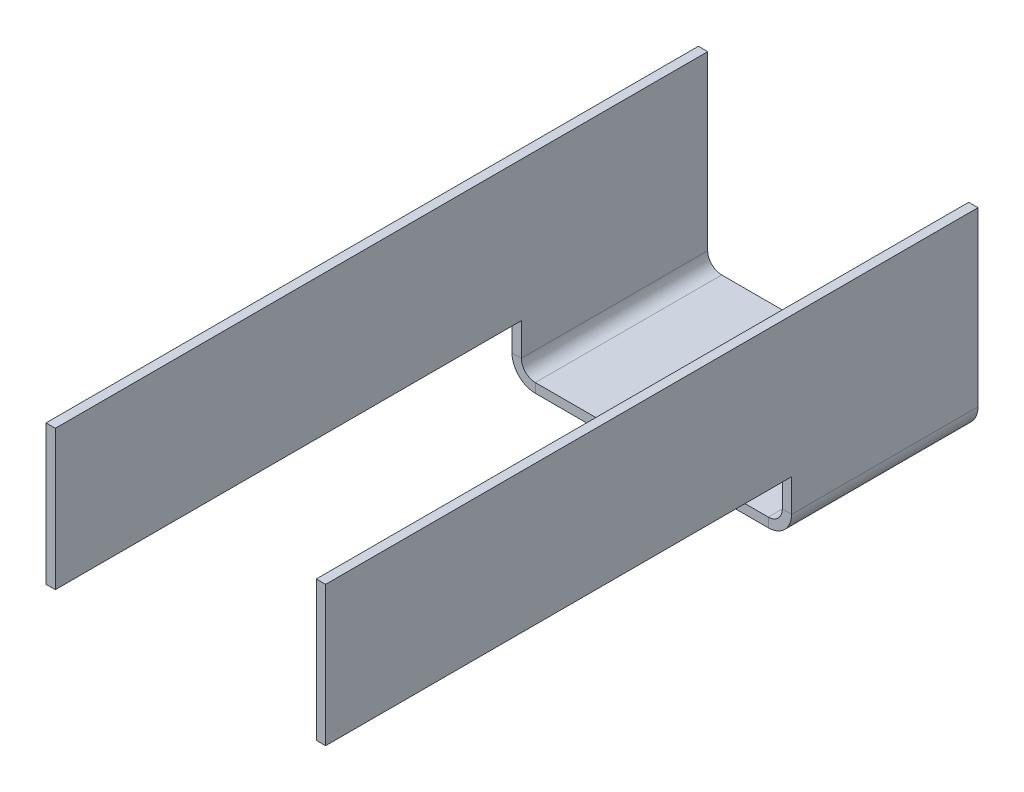
ISO-10303-21;
HEADER;
FILE_DESCRIPTION(('STEP AP214'),'2;1');
FILE_NAME('part.step','',(''),(''),'','','');
FILE_SCHEMA(('AUTOMOTIVE_DESIGN { 1 0 10303 214 1 1 1 1 }'));
ENDSEC;
DATA;
#1=APPLICATION_CONTEXT('core data for automotive mechanical design processes');
#2=APPLICATION_PROTOCOL_DEFINITION('international standard','automotive_design',2000,#1);
#3=PRODUCT_CONTEXT('',#1,'mechanical');
#4=PRODUCT('Part','Part','',(#3));
#5=PRODUCT_RELATED_PRODUCT_CATEGORY('part','',(#4));
#6=PRODUCT_DEFINITION_FORMATION('','',#4);
#7=PRODUCT_DEFINITION_CONTEXT('part definition',#1,'design');
#8=PRODUCT_DEFINITION('design','',#6,#7);
#9=PRODUCT_DEFINITION_SHAPE('','',#8);
#10=(LENGTH_UNIT() NAMED_UNIT(*) SI_UNIT(.MILLI.,.METRE.));
#11=(NAMED_UNIT(*) PLANE_ANGLE_UNIT() SI_UNIT($,.RADIAN.));
#12=(NAMED_UNIT(*) SI_UNIT($,.STERADIAN.) SOLID_ANGLE_UNIT());
#13=UNCERTAINTY_MEASURE_WITH_UNIT(LENGTH_MEASURE(1.E-05),#10,'distance_accuracy_value','');
#14=(GEOMETRIC_REPRESENTATION_CONTEXT(3) GLOBAL_UNCERTAINTY_ASSIGNED_CONTEXT((#13)) GLOBAL_UNIT_ASSIGNED_CONTEXT((#10,
#11,#12)) REPRESENTATION_CONTEXT('',''));
#15=CARTESIAN_POINT('',(0.,0.,0.));
#16=DIRECTION('',(0.,0.,1.));
#17=DIRECTION('',(1.,0.,0.));
#18=AXIS2_PLACEMENT_3D('',#15,#16,#17);
#19=CARTESIAN_POINT('',(-12.5,-1.,10.));
#20=DIRECTION('',(0.,0.,1.));
#21=DIRECTION('',(1.,0.,0.));
#22=AXIS2_PLACEMENT_3D('',#19,#20,#21);
#23=PLANE('',#22);
#24=DIRECTION('',(1.,0.,0.));
#25=VECTOR('',#24,1.);
#26=CARTESIAN_POINT('',(-12.5,0.,10.));
#27=LINE('',#26,#25);
#28=CARTESIAN_POINT('',(-12.5,0.,10.));
#29=VERTEX_POINT('',#28);
#30=CARTESIAN_POINT('',(12.5,0.,10.));
#31=VERTEX_POINT('',#30);
#32=EDGE_CURVE('E319',#29,#31,#27,.T.);
#33=ORIENTED_EDGE('',*,*,#32,.F.);
#34=DIRECTION('',(0.,1.,0.));
#35=VECTOR('',#34,1.);
#36=CARTESIAN_POINT('',(-12.5,-1.,10.));
#37=LINE('',#36,#35);
#38=CARTESIAN_POINT('',(-12.5,-1.,10.));
#39=VERTEX_POINT('',#38);
#40=EDGE_CURVE('E86',#39,#29,#37,.T.);
#41=ORIENTED_EDGE('',*,*,#40,.F.);
#42=DIRECTION('',(1.,0.,0.));
#43=VECTOR('',#42,1.);
#44=CARTESIAN_POINT('',(-12.5,-1.,10.));
#45=LINE('',#44,#43);
#46=CARTESIAN_POINT('',(12.5,-1.,10.));
#47=VERTEX_POINT('',#46);
#48=EDGE_CURVE('E325',#39,#47,#45,.T.);
#49=ORIENTED_EDGE('',*,*,#48,.T.);
#50=DIRECTION('',(0.,1.,0.));
#51=VECTOR('',#50,1.);
#52=CARTESIAN_POINT('',(12.5,-1.,10.));
#53=LINE('',#52,#51);
#54=EDGE_CURVE('E13',#47,#31,#53,.T.);
#55=ORIENTED_EDGE('',*,*,#54,.T.);
#56=EDGE_LOOP('',(#33,#41,#49,#55));
#57=FACE_BOUND('',#56,.T.);
#58=ADVANCED_FACE('F77',(#57),#23,.T.);
#59=CARTESIAN_POINT('',(-12.5,-1.,-10.));
#60=DIRECTION('',(0.,0.,-1.));
#61=DIRECTION('',(-1.,0.,0.));
#62=AXIS2_PLACEMENT_3D('',#59,#60,#61);
#63=PLANE('',#62);
#64=DIRECTION('',(-1.,0.,0.));
#65=VECTOR('',#64,1.);
#66=CARTESIAN_POINT('',(-12.5,0.,-10.));
#67=LINE('',#66,#65);
#68=CARTESIAN_POINT('',(12.5,0.,-10.));
#69=VERTEX_POINT('',#68);
#70=CARTESIAN_POINT('',(-12.5,0.,-10.));
#71=VERTEX_POINT('',#70);
#72=EDGE_CURVE('E330',#69,#71,#67,.T.);
#73=ORIENTED_EDGE('',*,*,#72,.F.);
#74=DIRECTION('',(0.,1.,0.));
#75=VECTOR('',#74,1.);
#76=CARTESIAN_POINT('',(12.5,-1.,-10.));
#77=LINE('',#76,#75);
#78=CARTESIAN_POINT('',(12.5,-1.,-10.));
#79=VERTEX_POINT('',#78);
#80=EDGE_CURVE('E81',#79,#69,#77,.T.);
#81=ORIENTED_EDGE('',*,*,#80,.F.);
#82=DIRECTION('',(-1.,0.,0.));
#83=VECTOR('',#82,1.);
#84=CARTESIAN_POINT('',(-12.5,-1.,-10.));
#85=LINE('',#84,#83);
#86=CARTESIAN_POINT('',(-12.5,-1.,-10.));
#87=VERTEX_POINT('',#86);
#88=EDGE_CURVE('E318',#79,#87,#85,.T.);
#89=ORIENTED_EDGE('',*,*,#88,.T.);
#90=DIRECTION('',(0.,1.,0.));
#91=VECTOR('',#90,1.);
#92=CARTESIAN_POINT('',(-12.5,-1.,-10.));
#93=LINE('',#92,#91);
#94=EDGE_CURVE('E338',#87,#71,#93,.T.);
#95=ORIENTED_EDGE('',*,*,#94,.T.);
#96=EDGE_LOOP('',(#73,#81,#89,#95));
#97=FACE_BOUND('',#96,.T.);
#98=ADVANCED_FACE('F79',(#97),#63,.T.);
#99=CARTESIAN_POINT('',(0.,-1.,0.));
#100=DIRECTION('',(0.,1.,0.));
#101=DIRECTION('',(0.,0.,1.));
#102=AXIS2_PLACEMENT_3D('',#99,#100,#101);
#103=PLANE('',#102);
#104=DIRECTION('',(0.,0.,-1.));
#105=VECTOR('',#104,1.);
#106=CARTESIAN_POINT('',(12.5,-1.,-10.));
#107=LINE('',#106,#105);
#108=EDGE_CURVE('E315',#47,#79,#107,.T.);
#109=ORIENTED_EDGE('',*,*,#108,.F.);
#110=ORIENTED_EDGE('',*,*,#48,.F.);
#111=DIRECTION('',(0.,0.,1.));
#112=VECTOR('',#111,1.);
#113=CARTESIAN_POINT('',(-12.5,-1.,-10.));
#114=LINE('',#113,#112);
#115=EDGE_CURVE('E322',#87,#39,#114,.T.);
#116=ORIENTED_EDGE('',*,*,#115,.F.);
#117=ORIENTED_EDGE('',*,*,#88,.F.);
#118=EDGE_LOOP('',(#109,#110,#116,#117));
#119=FACE_BOUND('',#118,.T.);
#120=ADVANCED_FACE('F380',(#119),#103,.F.);
#121=CARTESIAN_POINT('',(0.,0.,0.));
#122=DIRECTION('',(0.,1.,0.));
#123=DIRECTION('',(0.,0.,1.));
#124=AXIS2_PLACEMENT_3D('',#121,#122,#123);
#125=PLANE('',#124);
#126=DIRECTION('',(0.,0.,-1.));
#127=VECTOR('',#126,1.);
#128=CARTESIAN_POINT('',(12.5,0.,-10.));
#129=LINE('',#128,#127);
#130=EDGE_CURVE('E306',#31,#69,#129,.T.);
#131=ORIENTED_EDGE('',*,*,#130,.T.);
#132=ORIENTED_EDGE('',*,*,#72,.T.);
#133=DIRECTION('',(0.,0.,1.));
#134=VECTOR('',#133,1.);
#135=CARTESIAN_POINT('',(-12.5,0.,-10.));
#136=LINE('',#135,#134);
#137=EDGE_CURVE('E333',#71,#29,#136,.T.);
#138=ORIENTED_EDGE('',*,*,#137,.T.);
#139=ORIENTED_EDGE('',*,*,#32,.T.);
#140=EDGE_LOOP('',(#131,#132,#138,#139));
#141=FACE_BOUND('',#140,.T.);
#142=ADVANCED_FACE('F383',(#141),#125,.T.);
#143=CARTESIAN_POINT('',(-12.5,1.5,-10.));
#144=DIRECTION('',(0.,0.,-1.));
#145=DIRECTION('',(-1.,0.,0.));
#146=AXIS2_PLACEMENT_3D('',#143,#144,#145);
#147=PLANE('',#146);
#148=DIRECTION('',(1.,0.,0.));
#149=VECTOR('',#148,1.);
#150=CARTESIAN_POINT('',(-15.,1.49999999999999,-10.));
#151=LINE('',#150,#149);
#152=CARTESIAN_POINT('',(-14.,1.49999999999999,-10.));
#153=VERTEX_POINT('',#152);
#154=CARTESIAN_POINT('',(-15.,1.49999999999999,-10.));
#155=VERTEX_POINT('',#154);
#156=EDGE_CURVE('E265',#153,#155,#151,.F.);
#157=ORIENTED_EDGE('',*,*,#156,.F.);
#158=CARTESIAN_POINT('',(-12.5,1.5,-10.));
#159=DIRECTION('',(0.,0.,1.));
#160=DIRECTION('',(1.,0.,0.));
#161=AXIS2_PLACEMENT_3D('',#158,#159,#160);
#162=CIRCLE('',#161,1.5);
#163=EDGE_CURVE('E310',#71,#153,#162,.F.);
#164=ORIENTED_EDGE('',*,*,#163,.F.);
#165=ORIENTED_EDGE('',*,*,#94,.F.);
#166=CARTESIAN_POINT('',(-12.5,1.5,-10.));
#167=DIRECTION('',(0.,0.,1.));
#168=DIRECTION('',(1.,0.,0.));
#169=AXIS2_PLACEMENT_3D('',#166,#167,#168);
#170=CIRCLE('',#169,2.5);
#171=EDGE_CURVE('E303',#87,#155,#170,.F.);
#172=ORIENTED_EDGE('',*,*,#171,.T.);
#173=EDGE_LOOP('',(#157,#164,#165,#172));
#174=FACE_BOUND('',#173,.T.);
#175=ADVANCED_FACE('F386',(#174),#147,.T.);
#176=CARTESIAN_POINT('',(-12.5,1.5,10.));
#177=DIRECTION('',(0.,0.,-1.));
#178=DIRECTION('',(-1.,0.,0.));
#179=AXIS2_PLACEMENT_3D('',#176,#177,#178);
#180=PLANE('',#179);
#181=CARTESIAN_POINT('',(-12.5,1.5,10.));
#182=DIRECTION('',(0.,0.,1.));
#183=DIRECTION('',(1.,0.,0.));
#184=AXIS2_PLACEMENT_3D('',#181,#182,#183);
#185=CIRCLE('',#184,1.5);
#186=CARTESIAN_POINT('',(-14.,1.49999999999999,10.));
#187=VERTEX_POINT('',#186);
#188=EDGE_CURVE('E277',#187,#29,#185,.T.);
#189=ORIENTED_EDGE('',*,*,#188,.F.);
#190=DIRECTION('',(1.,0.,0.));
#191=VECTOR('',#190,1.);
#192=CARTESIAN_POINT('',(-14.,1.49999999999999,10.));
#193=LINE('',#192,#191);
#194=CARTESIAN_POINT('',(-15.,1.49999999999999,10.));
#195=VERTEX_POINT('',#194);
#196=EDGE_CURVE('E296',#187,#195,#193,.F.);
#197=ORIENTED_EDGE('',*,*,#196,.T.);
#198=CARTESIAN_POINT('',(-12.5,1.5,10.));
#199=DIRECTION('',(0.,0.,1.));
#200=DIRECTION('',(1.,0.,0.));
#201=AXIS2_PLACEMENT_3D('',#198,#199,#200);
#202=CIRCLE('',#201,2.5);
#203=EDGE_CURVE('E307',#195,#39,#202,.T.);
#204=ORIENTED_EDGE('',*,*,#203,.T.);
#205=ORIENTED_EDGE('',*,*,#40,.T.);
#206=EDGE_LOOP('',(#189,#197,#204,#205));
#207=FACE_BOUND('',#206,.T.);
#208=ADVANCED_FACE('F391',(#207),#180,.F.);
#209=CARTESIAN_POINT('',(-12.5,1.5,10.));
#210=DIRECTION('',(0.,0.,1.));
#211=DIRECTION('',(-1.,0.,0.));
#212=AXIS2_PLACEMENT_3D('',#209,#210,#211);
#213=CYLINDRICAL_SURFACE('',#212,2.5);
#214=ORIENTED_EDGE('',*,*,#115,.T.);
#215=ORIENTED_EDGE('',*,*,#203,.F.);
#216=DIRECTION('',(0.,0.,1.));
#217=VECTOR('',#216,1.);
#218=CARTESIAN_POINT('',(-15.,1.49999999999999,-10.));
#219=LINE('',#218,#217);
#220=EDGE_CURVE('E294',#195,#155,#219,.F.);
#221=ORIENTED_EDGE('',*,*,#220,.T.);
#222=ORIENTED_EDGE('',*,*,#171,.F.);
#223=EDGE_LOOP('',(#214,#215,#221,#222));
#224=FACE_BOUND('',#223,.T.);
#225=ADVANCED_FACE('F394',(#224),#213,.T.);
#226=CARTESIAN_POINT('',(-12.5,1.5,10.));
#227=DIRECTION('',(0.,0.,1.));
#228=DIRECTION('',(-1.,0.,0.));
#229=AXIS2_PLACEMENT_3D('',#226,#227,#228);
#230=CYLINDRICAL_SURFACE('',#229,1.5);
#231=ORIENTED_EDGE('',*,*,#137,.F.);
#232=ORIENTED_EDGE('',*,*,#163,.T.);
#233=DIRECTION('',(0.,0.,1.));
#234=VECTOR('',#233,1.);
#235=CARTESIAN_POINT('',(-14.,1.49999999999999,-10.));
#236=LINE('',#235,#234);
#237=EDGE_CURVE('E299',#153,#187,#236,.T.);
#238=ORIENTED_EDGE('',*,*,#237,.T.);
#239=ORIENTED_EDGE('',*,*,#188,.T.);
#240=EDGE_LOOP('',(#231,#232,#238,#239));
#241=FACE_BOUND('',#240,.T.);
#242=ADVANCED_FACE('F399',(#241),#230,.F.);
#243=CARTESIAN_POINT('',(-15.0000000000001,20.,10.));
#244=DIRECTION('',(0.,0.,-1.));
#245=DIRECTION('',(-1.,0.,0.));
#246=AXIS2_PLACEMENT_3D('',#243,#244,#245);
#247=PLANE('',#246);
#248=DIRECTION('',(0.,-1.,0.));
#249=VECTOR('',#248,1.);
#250=CARTESIAN_POINT('',(-14.0000000000001,20.,10.));
#251=LINE('',#250,#249);
#252=CARTESIAN_POINT('',(-14.,5.,10.));
#253=VERTEX_POINT('',#252);
#254=EDGE_CURVE('E291',#187,#253,#251,.F.);
#255=ORIENTED_EDGE('',*,*,#254,.T.);
#256=DIRECTION('',(1.,0.,0.));
#257=VECTOR('',#256,1.);
#258=CARTESIAN_POINT('',(-15.,5.,10.));
#259=LINE('',#258,#257);
#260=CARTESIAN_POINT('',(-15.,5.,10.));
#261=VERTEX_POINT('',#260);
#262=EDGE_CURVE('E236',#261,#253,#259,.T.);
#263=ORIENTED_EDGE('',*,*,#262,.F.);
#264=DIRECTION('',(0.,1.,0.));
#265=VECTOR('',#264,1.);
#266=CARTESIAN_POINT('',(-15.,0.,10.));
#267=LINE('',#266,#265);
#268=EDGE_CURVE('E283',#195,#261,#267,.T.);
#269=ORIENTED_EDGE('',*,*,#268,.F.);
#270=ORIENTED_EDGE('',*,*,#196,.F.);
#271=EDGE_LOOP('',(#255,#263,#269,#270));
#272=FACE_BOUND('',#271,.T.);
#273=ADVANCED_FACE('F402',(#272),#247,.F.);
#274=CARTESIAN_POINT('',(-15.,0.,-10.));
#275=DIRECTION('',(0.,0.,1.));
#276=DIRECTION('',(1.,0.,0.));
#277=AXIS2_PLACEMENT_3D('',#274,#275,#276);
#278=PLANE('',#277);
#279=ORIENTED_EDGE('',*,*,#156,.T.);
#280=DIRECTION('',(0.,-1.,0.));
#281=VECTOR('',#280,1.);
#282=CARTESIAN_POINT('',(-15.,0.,-10.));
#283=LINE('',#282,#281);
#284=CARTESIAN_POINT('',(-15.0000000000001,20.,-10.));
#285=VERTEX_POINT('',#284);
#286=EDGE_CURVE('E278',#285,#155,#283,.T.);
#287=ORIENTED_EDGE('',*,*,#286,.F.);
#288=DIRECTION('',(1.,0.,0.));
#289=VECTOR('',#288,1.);
#290=CARTESIAN_POINT('',(-15.0000000000001,20.,-10.));
#291=LINE('',#290,#289);
#292=CARTESIAN_POINT('',(-14.0000000000001,20.,-10.));
#293=VERTEX_POINT('',#292);
#294=EDGE_CURVE('E274',#285,#293,#291,.T.);
#295=ORIENTED_EDGE('',*,*,#294,.T.);
#296=DIRECTION('',(0.,1.,0.));
#297=VECTOR('',#296,1.);
#298=CARTESIAN_POINT('',(-14.,0.,-10.));
#299=LINE('',#298,#297);
#300=EDGE_CURVE('E286',#293,#153,#299,.F.);
#301=ORIENTED_EDGE('',*,*,#300,.T.);
#302=EDGE_LOOP('',(#279,#287,#295,#301));
#303=FACE_BOUND('',#302,.T.);
#304=ADVANCED_FACE('F409',(#303),#278,.F.);
#305=CARTESIAN_POINT('',(-15.,0.,0.));
#306=DIRECTION('',(1.,0.,0.));
#307=DIRECTION('',(0.,1.,0.));
#308=AXIS2_PLACEMENT_3D('',#305,#306,#307);
#309=PLANE('',#308);
#310=ORIENTED_EDGE('',*,*,#220,.F.);
#311=ORIENTED_EDGE('',*,*,#268,.T.);
#312=DIRECTION('',(0.,0.,-1.));
#313=VECTOR('',#312,1.);
#314=CARTESIAN_POINT('',(-15.,5.,10.));
#315=LINE('',#314,#313);
#316=CARTESIAN_POINT('',(-15.,4.99999999999999,60.));
#317=VERTEX_POINT('',#316);
#318=EDGE_CURVE('E228',#317,#261,#315,.T.);
#319=ORIENTED_EDGE('',*,*,#318,.F.);
#320=DIRECTION('',(0.,-1.,0.));
#321=VECTOR('',#320,1.);
#322=CARTESIAN_POINT('',(-15.0000000000001,20.,60.));
#323=LINE('',#322,#321);
#324=CARTESIAN_POINT('',(-15.0000000000001,20.,60.));
#325=VERTEX_POINT('',#324);
#326=EDGE_CURVE('E225',#325,#317,#323,.T.);
#327=ORIENTED_EDGE('',*,*,#326,.F.);
#328=DIRECTION('',(0.,0.,-1.));
#329=VECTOR('',#328,1.);
#330=CARTESIAN_POINT('',(-15.0000000000001,20.,0.));
#331=LINE('',#330,#329);
#332=EDGE_CURVE('E281',#325,#285,#331,.T.);
#333=ORIENTED_EDGE('',*,*,#332,.T.);
#334=ORIENTED_EDGE('',*,*,#286,.T.);
#335=EDGE_LOOP('',(#310,#311,#319,#327,#333,#334));
#336=FACE_BOUND('',#335,.T.);
#337=ADVANCED_FACE('F418',(#336),#309,.F.);
#338=CARTESIAN_POINT('',(-14.,0.,0.));
#339=DIRECTION('',(1.,0.,0.));
#340=DIRECTION('',(0.,1.,0.));
#341=AXIS2_PLACEMENT_3D('',#338,#339,#340);
#342=PLANE('',#341);
#343=ORIENTED_EDGE('',*,*,#254,.F.);
#344=ORIENTED_EDGE('',*,*,#237,.F.);
#345=ORIENTED_EDGE('',*,*,#300,.F.);
#346=DIRECTION('',(0.,0.,1.));
#347=VECTOR('',#346,1.);
#348=CARTESIAN_POINT('',(-14.0000000000001,20.,-10.));
#349=LINE('',#348,#347);
#350=CARTESIAN_POINT('',(-14.,20.,60.));
#351=VERTEX_POINT('',#350);
#352=EDGE_CURVE('E289',#351,#293,#349,.F.);
#353=ORIENTED_EDGE('',*,*,#352,.F.);
#354=DIRECTION('',(0.,-1.,0.));
#355=VECTOR('',#354,1.);
#356=CARTESIAN_POINT('',(-14.,20.,60.));
#357=LINE('',#356,#355);
#358=CARTESIAN_POINT('',(-14.,4.99999999999999,60.));
#359=VERTEX_POINT('',#358);
#360=EDGE_CURVE('E223',#351,#359,#357,.T.);
#361=ORIENTED_EDGE('',*,*,#360,.T.);
#362=DIRECTION('',(0.,0.,-1.));
#363=VECTOR('',#362,1.);
#364=CARTESIAN_POINT('',(-14.,5.,10.));
#365=LINE('',#364,#363);
#366=EDGE_CURVE('E229',#359,#253,#365,.T.);
#367=ORIENTED_EDGE('',*,*,#366,.T.);
#368=EDGE_LOOP('',(#343,#344,#345,#353,#361,#367));
#369=FACE_BOUND('',#368,.T.);
#370=ADVANCED_FACE('F414',(#369),#342,.T.);
#371=CARTESIAN_POINT('',(-15.0000000000001,20.,-10.));
#372=DIRECTION('',(0.,-1.,0.));
#373=DIRECTION('',(1.,0.,0.));
#374=AXIS2_PLACEMENT_3D('',#371,#372,#373);
#375=PLANE('',#374);
#376=ORIENTED_EDGE('',*,*,#352,.T.);
#377=ORIENTED_EDGE('',*,*,#294,.F.);
#378=ORIENTED_EDGE('',*,*,#332,.F.);
#379=DIRECTION('',(1.,0.,0.));
#380=VECTOR('',#379,1.);
#381=CARTESIAN_POINT('',(-15.0000000000001,20.,60.));
#382=LINE('',#381,#380);
#383=EDGE_CURVE('E231',#325,#351,#382,.T.);
#384=ORIENTED_EDGE('',*,*,#383,.T.);
#385=EDGE_LOOP('',(#376,#377,#378,#384));
#386=FACE_BOUND('',#385,.T.);
#387=ADVANCED_FACE('F411',(#386),#375,.F.);
#388=CARTESIAN_POINT('',(12.5,1.5,10.));
#389=DIRECTION('',(0.,0.,1.));
#390=DIRECTION('',(0.,-1.,0.));
#391=AXIS2_PLACEMENT_3D('',#388,#389,#390);
#392=PLANE('',#391);
#393=DIRECTION('',(-1.,0.,0.));
#394=VECTOR('',#393,1.);
#395=CARTESIAN_POINT('',(15.,1.49999999999999,10.));
#396=LINE('',#395,#394);
#397=CARTESIAN_POINT('',(14.,1.49999999999999,10.));
#398=VERTEX_POINT('',#397);
#399=CARTESIAN_POINT('',(15.,1.49999999999999,10.));
#400=VERTEX_POINT('',#399);
#401=EDGE_CURVE('E238',#398,#400,#396,.F.);
#402=ORIENTED_EDGE('',*,*,#401,.F.);
#403=CARTESIAN_POINT('',(12.5,1.5,10.));
#404=DIRECTION('',(0.,0.,-1.));
#405=DIRECTION('',(0.,1.,0.));
#406=AXIS2_PLACEMENT_3D('',#403,#404,#405);
#407=CIRCLE('',#406,1.5);
#408=EDGE_CURVE('E269',#31,#398,#407,.F.);
#409=ORIENTED_EDGE('',*,*,#408,.F.);
#410=ORIENTED_EDGE('',*,*,#54,.F.);
#411=CARTESIAN_POINT('',(12.5,1.5,10.));
#412=DIRECTION('',(0.,0.,-1.));
#413=DIRECTION('',(0.,1.,0.));
#414=AXIS2_PLACEMENT_3D('',#411,#412,#413);
#415=CIRCLE('',#414,2.5);
#416=EDGE_CURVE('E262',#47,#400,#415,.F.);
#417=ORIENTED_EDGE('',*,*,#416,.T.);
#418=EDGE_LOOP('',(#402,#409,#410,#417));
#419=FACE_BOUND('',#418,.T.);
#420=ADVANCED_FACE('F364',(#419),#392,.T.);
#421=CARTESIAN_POINT('',(12.5,1.5,-10.));
#422=DIRECTION('',(0.,0.,1.));
#423=DIRECTION('',(0.,-1.,0.));
#424=AXIS2_PLACEMENT_3D('',#421,#422,#423);
#425=PLANE('',#424);
#426=CARTESIAN_POINT('',(12.5,1.5,-10.));
#427=DIRECTION('',(0.,0.,-1.));
#428=DIRECTION('',(0.,1.,0.));
#429=AXIS2_PLACEMENT_3D('',#426,#427,#428);
#430=CIRCLE('',#429,1.5);
#431=CARTESIAN_POINT('',(14.,1.49999999999999,-10.));
#432=VERTEX_POINT('',#431);
#433=EDGE_CURVE('E244',#432,#69,#430,.T.);
#434=ORIENTED_EDGE('',*,*,#433,.F.);
#435=DIRECTION('',(-1.,0.,0.));
#436=VECTOR('',#435,1.);
#437=CARTESIAN_POINT('',(14.,1.49999999999999,-10.));
#438=LINE('',#437,#436);
#439=CARTESIAN_POINT('',(15.,1.49999999999999,-10.));
#440=VERTEX_POINT('',#439);
#441=EDGE_CURVE('E256',#432,#440,#438,.F.);
#442=ORIENTED_EDGE('',*,*,#441,.T.);
#443=CARTESIAN_POINT('',(12.5,1.5,-10.));
#444=DIRECTION('',(0.,0.,-1.));
#445=DIRECTION('',(0.,1.,0.));
#446=AXIS2_PLACEMENT_3D('',#443,#444,#445);
#447=CIRCLE('',#446,2.5);
#448=EDGE_CURVE('E266',#440,#79,#447,.T.);
#449=ORIENTED_EDGE('',*,*,#448,.T.);
#450=ORIENTED_EDGE('',*,*,#80,.T.);
#451=EDGE_LOOP('',(#434,#442,#449,#450));
#452=FACE_BOUND('',#451,.T.);
#453=ADVANCED_FACE('F345',(#452),#425,.F.);
#454=CARTESIAN_POINT('',(12.5,1.5,-10.));
#455=DIRECTION('',(0.,0.,-1.));
#456=DIRECTION('',(1.,0.,0.));
#457=AXIS2_PLACEMENT_3D('',#454,#455,#456);
#458=CYLINDRICAL_SURFACE('',#457,2.5);
#459=ORIENTED_EDGE('',*,*,#108,.T.);
#460=ORIENTED_EDGE('',*,*,#448,.F.);
#461=DIRECTION('',(0.,0.,-1.));
#462=VECTOR('',#461,1.);
#463=CARTESIAN_POINT('',(15.,1.49999999999999,10.));
#464=LINE('',#463,#462);
#465=EDGE_CURVE('E253',#440,#400,#464,.F.);
#466=ORIENTED_EDGE('',*,*,#465,.T.);
#467=ORIENTED_EDGE('',*,*,#416,.F.);
#468=EDGE_LOOP('',(#459,#460,#466,#467));
#469=FACE_BOUND('',#468,.T.);
#470=ADVANCED_FACE('F360',(#469),#458,.T.);
#471=CARTESIAN_POINT('',(12.5,1.5,-10.));
#472=DIRECTION('',(0.,0.,-1.));
#473=DIRECTION('',(1.,0.,0.));
#474=AXIS2_PLACEMENT_3D('',#471,#472,#473);
#475=CYLINDRICAL_SURFACE('',#474,1.5);
#476=ORIENTED_EDGE('',*,*,#130,.F.);
#477=ORIENTED_EDGE('',*,*,#408,.T.);
#478=DIRECTION('',(0.,0.,-1.));
#479=VECTOR('',#478,1.);
#480=CARTESIAN_POINT('',(14.,1.49999999999999,10.));
#481=LINE('',#480,#479);
#482=EDGE_CURVE('E259',#398,#432,#481,.T.);
#483=ORIENTED_EDGE('',*,*,#482,.T.);
#484=ORIENTED_EDGE('',*,*,#433,.T.);
#485=EDGE_LOOP('',(#476,#477,#483,#484));
#486=FACE_BOUND('',#485,.T.);
#487=ADVANCED_FACE('F349',(#486),#475,.F.);
#488=CARTESIAN_POINT('',(15.,0.,10.));
#489=DIRECTION('',(0.,0.,-1.));
#490=DIRECTION('',(-1.,0.,0.));
#491=AXIS2_PLACEMENT_3D('',#488,#489,#490);
#492=PLANE('',#491);
#493=DIRECTION('',(0.,-1.,0.));
#494=VECTOR('',#493,1.);
#495=CARTESIAN_POINT('',(15.,0.,10.));
#496=LINE('',#495,#494);
#497=CARTESIAN_POINT('',(15.,5.,10.));
#498=VERTEX_POINT('',#497);
#499=EDGE_CURVE('E94',#498,#400,#496,.T.);
#500=ORIENTED_EDGE('',*,*,#499,.F.);
#501=DIRECTION('',(1.,0.,0.));
#502=VECTOR('',#501,1.);
#503=CARTESIAN_POINT('',(14.,5.,10.));
#504=LINE('',#503,#502);
#505=CARTESIAN_POINT('',(14.,5.,10.));
#506=VERTEX_POINT('',#505);
#507=EDGE_CURVE('E98',#506,#498,#504,.T.);
#508=ORIENTED_EDGE('',*,*,#507,.F.);
#509=DIRECTION('',(0.,1.,0.));
#510=VECTOR('',#509,1.);
#511=CARTESIAN_POINT('',(14.,0.,10.));
#512=LINE('',#511,#510);
#513=EDGE_CURVE('E251',#506,#398,#512,.F.);
#514=ORIENTED_EDGE('',*,*,#513,.T.);
#515=ORIENTED_EDGE('',*,*,#401,.T.);
#516=EDGE_LOOP('',(#500,#508,#514,#515));
#517=FACE_BOUND('',#516,.T.);
#518=ADVANCED_FACE('F365',(#517),#492,.F.);
#519=CARTESIAN_POINT('',(15.0000000000001,20.,-10.));
#520=DIRECTION('',(0.,0.,1.));
#521=DIRECTION('',(1.,0.,0.));
#522=AXIS2_PLACEMENT_3D('',#519,#520,#521);
#523=PLANE('',#522);
#524=ORIENTED_EDGE('',*,*,#441,.F.);
#525=DIRECTION('',(0.,-1.,0.));
#526=VECTOR('',#525,1.);
#527=CARTESIAN_POINT('',(14.0000000000001,20.,-10.));
#528=LINE('',#527,#526);
#529=CARTESIAN_POINT('',(14.0000000000001,20.,-10.));
#530=VERTEX_POINT('',#529);
#531=EDGE_CURVE('E201',#432,#530,#528,.F.);
#532=ORIENTED_EDGE('',*,*,#531,.T.);
#533=DIRECTION('',(-1.,0.,0.));
#534=VECTOR('',#533,1.);
#535=CARTESIAN_POINT('',(15.0000000000001,20.,-10.));
#536=LINE('',#535,#534);
#537=CARTESIAN_POINT('',(15.0000000000001,20.,-10.));
#538=VERTEX_POINT('',#537);
#539=EDGE_CURVE('E197',#538,#530,#536,.T.);
#540=ORIENTED_EDGE('',*,*,#539,.F.);
#541=DIRECTION('',(0.,1.,0.));
#542=VECTOR('',#541,1.);
#543=CARTESIAN_POINT('',(15.,0.,-10.));
#544=LINE('',#543,#542);
#545=EDGE_CURVE('E247',#440,#538,#544,.T.);
#546=ORIENTED_EDGE('',*,*,#545,.F.);
#547=EDGE_LOOP('',(#524,#532,#540,#546));
#548=FACE_BOUND('',#547,.T.);
#549=ADVANCED_FACE('F353',(#548),#523,.F.);
#550=CARTESIAN_POINT('',(15.,0.,0.));
#551=DIRECTION('',(-1.,0.,0.));
#552=DIRECTION('',(0.,-1.,0.));
#553=AXIS2_PLACEMENT_3D('',#550,#551,#552);
#554=PLANE('',#553);
#555=ORIENTED_EDGE('',*,*,#465,.F.);
#556=ORIENTED_EDGE('',*,*,#545,.T.);
#557=DIRECTION('',(0.,0.,1.));
#558=VECTOR('',#557,1.);
#559=CARTESIAN_POINT('',(15.0000000000001,20.,0.));
#560=LINE('',#559,#558);
#561=CARTESIAN_POINT('',(15.0000000000001,20.,60.));
#562=VERTEX_POINT('',#561);
#563=EDGE_CURVE('E245',#538,#562,#560,.T.);
#564=ORIENTED_EDGE('',*,*,#563,.T.);
#565=DIRECTION('',(0.,-1.,0.));
#566=VECTOR('',#565,1.);
#567=CARTESIAN_POINT('',(15.0000000000001,20.,60.));
#568=LINE('',#567,#566);
#569=CARTESIAN_POINT('',(15.,4.99999999999999,60.));
#570=VERTEX_POINT('',#569);
#571=EDGE_CURVE('E209',#562,#570,#568,.T.);
#572=ORIENTED_EDGE('',*,*,#571,.T.);
#573=DIRECTION('',(0.,0.,-1.));
#574=VECTOR('',#573,1.);
#575=CARTESIAN_POINT('',(15.,5.,10.));
#576=LINE('',#575,#574);
#577=EDGE_CURVE('E215',#570,#498,#576,.T.);
#578=ORIENTED_EDGE('',*,*,#577,.T.);
#579=ORIENTED_EDGE('',*,*,#499,.T.);
#580=EDGE_LOOP('',(#555,#556,#564,#572,#578,#579));
#581=FACE_BOUND('',#580,.T.);
#582=ADVANCED_FACE('F357',(#581),#554,.F.);
#583=CARTESIAN_POINT('',(14.,0.,0.));
#584=DIRECTION('',(-1.,0.,0.));
#585=DIRECTION('',(0.,-1.,0.));
#586=AXIS2_PLACEMENT_3D('',#583,#584,#585);
#587=PLANE('',#586);
#588=ORIENTED_EDGE('',*,*,#531,.F.);
#589=ORIENTED_EDGE('',*,*,#482,.F.);
#590=ORIENTED_EDGE('',*,*,#513,.F.);
#591=DIRECTION('',(0.,0.,-1.));
#592=VECTOR('',#591,1.);
#593=CARTESIAN_POINT('',(14.,5.,10.));
#594=LINE('',#593,#592);
#595=CARTESIAN_POINT('',(14.,4.99999999999999,60.));
#596=VERTEX_POINT('',#595);
#597=EDGE_CURVE('E211',#596,#506,#594,.T.);
#598=ORIENTED_EDGE('',*,*,#597,.F.);
#599=DIRECTION('',(0.,-1.,0.));
#600=VECTOR('',#599,1.);
#601=CARTESIAN_POINT('',(14.0000000000001,20.,60.));
#602=LINE('',#601,#600);
#603=CARTESIAN_POINT('',(14.0000000000001,20.,60.));
#604=VERTEX_POINT('',#603);
#605=EDGE_CURVE('E206',#604,#596,#602,.T.);
#606=ORIENTED_EDGE('',*,*,#605,.F.);
#607=DIRECTION('',(0.,0.,-1.));
#608=VECTOR('',#607,1.);
#609=CARTESIAN_POINT('',(14.0000000000001,20.,10.));
#610=LINE('',#609,#608);
#611=EDGE_CURVE('E190',#530,#604,#610,.F.);
#612=ORIENTED_EDGE('',*,*,#611,.F.);
#613=EDGE_LOOP('',(#588,#589,#590,#598,#606,#612));
#614=FACE_BOUND('',#613,.T.);
#615=ADVANCED_FACE('F213',(#614),#587,.T.);
#616=CARTESIAN_POINT('',(15.0000000000001,20.,10.));
#617=DIRECTION('',(0.,-1.,0.));
#618=DIRECTION('',(1.,0.,0.));
#619=AXIS2_PLACEMENT_3D('',#616,#617,#618);
#620=PLANE('',#619);
#621=ORIENTED_EDGE('',*,*,#611,.T.);
#622=DIRECTION('',(1.,0.,0.));
#623=VECTOR('',#622,1.);
#624=CARTESIAN_POINT('',(14.0000000000001,20.,60.));
#625=LINE('',#624,#623);
#626=EDGE_CURVE('E194',#604,#562,#625,.T.);
#627=ORIENTED_EDGE('',*,*,#626,.T.);
#628=ORIENTED_EDGE('',*,*,#563,.F.);
#629=ORIENTED_EDGE('',*,*,#539,.T.);
#630=EDGE_LOOP('',(#621,#627,#628,#629));
#631=FACE_BOUND('',#630,.T.);
#632=ADVANCED_FACE('F192',(#631),#620,.F.);
#633=CARTESIAN_POINT('',(-15.,5.,10.));
#634=DIRECTION('',(0.,-1.,0.));
#635=DIRECTION('',(1.,0.,0.));
#636=AXIS2_PLACEMENT_3D('',#633,#634,#635);
#637=PLANE('',#636);
#638=ORIENTED_EDGE('',*,*,#366,.F.);
#639=DIRECTION('',(1.,0.,0.));
#640=VECTOR('',#639,1.);
#641=CARTESIAN_POINT('',(-15.,4.99999999999999,60.));
#642=LINE('',#641,#640);
#643=EDGE_CURVE('E239',#317,#359,#642,.T.);
#644=ORIENTED_EDGE('',*,*,#643,.F.);
#645=ORIENTED_EDGE('',*,*,#318,.T.);
#646=ORIENTED_EDGE('',*,*,#262,.T.);
#647=EDGE_LOOP('',(#638,#644,#645,#646));
#648=FACE_BOUND('',#647,.T.);
#649=ADVANCED_FACE('F486',(#648),#637,.T.);
#650=CARTESIAN_POINT('',(-15.0000000000001,20.,60.));
#651=DIRECTION('',(0.,0.,1.));
#652=DIRECTION('',(1.,0.,0.));
#653=AXIS2_PLACEMENT_3D('',#650,#651,#652);
#654=PLANE('',#653);
#655=ORIENTED_EDGE('',*,*,#360,.F.);
#656=ORIENTED_EDGE('',*,*,#383,.F.);
#657=ORIENTED_EDGE('',*,*,#326,.T.);
#658=ORIENTED_EDGE('',*,*,#643,.T.);
#659=EDGE_LOOP('',(#655,#656,#657,#658));
#660=FACE_BOUND('',#659,.T.);
#661=ADVANCED_FACE('F490',(#660),#654,.T.);
#662=CARTESIAN_POINT('',(14.,5.,10.));
#663=DIRECTION('',(0.,-1.,0.));
#664=DIRECTION('',(1.,0.,0.));
#665=AXIS2_PLACEMENT_3D('',#662,#663,#664);
#666=PLANE('',#665);
#667=ORIENTED_EDGE('',*,*,#577,.F.);
#668=DIRECTION('',(1.,0.,0.));
#669=VECTOR('',#668,1.);
#670=CARTESIAN_POINT('',(14.,4.99999999999999,60.));
#671=LINE('',#670,#669);
#672=EDGE_CURVE('E210',#596,#570,#671,.T.);
#673=ORIENTED_EDGE('',*,*,#672,.F.);
#674=ORIENTED_EDGE('',*,*,#597,.T.);
#675=ORIENTED_EDGE('',*,*,#507,.T.);
#676=EDGE_LOOP('',(#667,#673,#674,#675));
#677=FACE_BOUND('',#676,.T.);
#678=ADVANCED_FACE('F501',(#677),#666,.T.);
#679=CARTESIAN_POINT('',(14.0000000000001,20.,60.));
#680=DIRECTION('',(0.,0.,1.));
#681=DIRECTION('',(1.,0.,0.));
#682=AXIS2_PLACEMENT_3D('',#679,#680,#681);
#683=PLANE('',#682);
#684=ORIENTED_EDGE('',*,*,#571,.F.);
#685=ORIENTED_EDGE('',*,*,#626,.F.);
#686=ORIENTED_EDGE('',*,*,#605,.T.);
#687=ORIENTED_EDGE('',*,*,#672,.T.);
#688=EDGE_LOOP('',(#684,#685,#686,#687));
#689=FACE_BOUND('',#688,.T.);
#690=ADVANCED_FACE('F205',(#689),#683,.T.);
#691=CLOSED_SHELL('',(#58,#98,#120,#142,#175,#208,#225,#242,#273,#304,#337,#370,#387,#420,#453,
#470,#487,#518,#549,#582,#615,#632,#649,#661,#678,#690));
#692=MANIFOLD_SOLID_BREP('B2',#691);
#693=ADVANCED_BREP_SHAPE_REPRESENTATION('',(#18,#692),#14);
#694=SHAPE_DEFINITION_REPRESENTATION(#9,#693);
ENDSEC;
END-ISO-10303-21;
